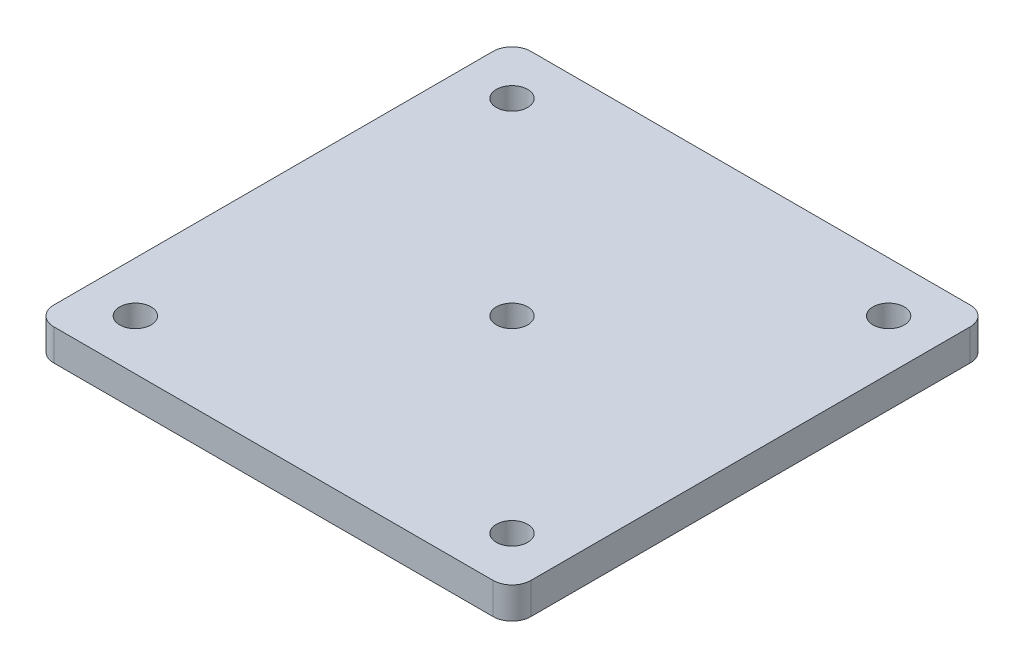
ISO-10303-21;
HEADER;
FILE_DESCRIPTION(('STEP AP214'),'2;1');
FILE_NAME('part.step','',(''),(''),'','','');
FILE_SCHEMA(('AUTOMOTIVE_DESIGN { 1 0 10303 214 1 1 1 1 }'));
ENDSEC;
DATA;
#1=APPLICATION_CONTEXT('core data for automotive mechanical design processes');
#2=APPLICATION_PROTOCOL_DEFINITION('international standard','automotive_design',2000,#1);
#3=PRODUCT_CONTEXT('',#1,'mechanical');
#4=PRODUCT('Part','Part','',(#3));
#5=PRODUCT_RELATED_PRODUCT_CATEGORY('part','',(#4));
#6=PRODUCT_DEFINITION_FORMATION('','',#4);
#7=PRODUCT_DEFINITION_CONTEXT('part definition',#1,'design');
#8=PRODUCT_DEFINITION('design','',#6,#7);
#9=PRODUCT_DEFINITION_SHAPE('','',#8);
#10=(LENGTH_UNIT() NAMED_UNIT(*) SI_UNIT(.MILLI.,.METRE.));
#11=(NAMED_UNIT(*) PLANE_ANGLE_UNIT() SI_UNIT($,.RADIAN.));
#12=(NAMED_UNIT(*) SI_UNIT($,.STERADIAN.) SOLID_ANGLE_UNIT());
#13=UNCERTAINTY_MEASURE_WITH_UNIT(LENGTH_MEASURE(1.E-05),#10,'distance_accuracy_value','');
#14=(GEOMETRIC_REPRESENTATION_CONTEXT(3) GLOBAL_UNCERTAINTY_ASSIGNED_CONTEXT((#13)) GLOBAL_UNIT_ASSIGNED_CONTEXT((#10,
#11,#12)) REPRESENTATION_CONTEXT('',''));
#15=CARTESIAN_POINT('',(0.,0.,0.));
#16=DIRECTION('',(0.,0.,1.));
#17=DIRECTION('',(1.,0.,0.));
#18=AXIS2_PLACEMENT_3D('',#15,#16,#17);
#19=CARTESIAN_POINT('',(35.,5.,-35.));
#20=DIRECTION('',(0.,-1.,0.));
#21=DIRECTION('',(0.,0.,-1.));
#22=AXIS2_PLACEMENT_3D('',#19,#20,#21);
#23=PLANE('',#22);
#24=CARTESIAN_POINT('',(35.,5.,-35.));
#25=DIRECTION('',(0.,1.,0.));
#26=DIRECTION('',(0.,0.,-1.));
#27=AXIS2_PLACEMENT_3D('',#24,#25,#26);
#28=CIRCLE('',#27,3.);
#29=CARTESIAN_POINT('',(38.,5.,-35.));
#30=VERTEX_POINT('',#29);
#31=CARTESIAN_POINT('',(35.,5.,-38.));
#32=VERTEX_POINT('',#31);
#33=EDGE_CURVE('E151',#30,#32,#28,.T.);
#34=ORIENTED_EDGE('',*,*,#33,.T.);
#35=DIRECTION('',(-1.,0.,0.));
#36=VECTOR('',#35,1.);
#37=CARTESIAN_POINT('',(-35.,5.,-38.));
#38=LINE('',#37,#36);
#39=CARTESIAN_POINT('',(-35.,5.,-38.));
#40=VERTEX_POINT('',#39);
#41=EDGE_CURVE('E99',#32,#40,#38,.T.);
#42=ORIENTED_EDGE('',*,*,#41,.T.);
#43=CARTESIAN_POINT('',(-35.,5.,-35.));
#44=DIRECTION('',(0.,1.,0.));
#45=DIRECTION('',(0.,0.,-1.));
#46=AXIS2_PLACEMENT_3D('',#43,#44,#45);
#47=CIRCLE('',#46,3.);
#48=CARTESIAN_POINT('',(-38.,5.,-35.));
#49=VERTEX_POINT('',#48);
#50=EDGE_CURVE('E166',#40,#49,#47,.T.);
#51=ORIENTED_EDGE('',*,*,#50,.T.);
#52=DIRECTION('',(0.,0.,1.));
#53=VECTOR('',#52,1.);
#54=CARTESIAN_POINT('',(-38.,5.,35.));
#55=LINE('',#54,#53);
#56=CARTESIAN_POINT('',(-38.,5.,35.));
#57=VERTEX_POINT('',#56);
#58=EDGE_CURVE('E179',#49,#57,#55,.T.);
#59=ORIENTED_EDGE('',*,*,#58,.T.);
#60=CARTESIAN_POINT('',(-35.,5.,35.));
#61=DIRECTION('',(0.,1.,0.));
#62=DIRECTION('',(0.,0.,-1.));
#63=AXIS2_PLACEMENT_3D('',#60,#61,#62);
#64=CIRCLE('',#63,3.);
#65=CARTESIAN_POINT('',(-35.,5.,38.));
#66=VERTEX_POINT('',#65);
#67=EDGE_CURVE('E118',#57,#66,#64,.T.);
#68=ORIENTED_EDGE('',*,*,#67,.T.);
#69=DIRECTION('',(1.,0.,0.));
#70=VECTOR('',#69,1.);
#71=CARTESIAN_POINT('',(-35.,5.,38.));
#72=LINE('',#71,#70);
#73=CARTESIAN_POINT('',(35.,5.,38.));
#74=VERTEX_POINT('',#73);
#75=EDGE_CURVE('E112',#66,#74,#72,.T.);
#76=ORIENTED_EDGE('',*,*,#75,.T.);
#77=CARTESIAN_POINT('',(35.,5.,35.));
#78=DIRECTION('',(0.,1.,0.));
#79=DIRECTION('',(0.,0.,-1.));
#80=AXIS2_PLACEMENT_3D('',#77,#78,#79);
#81=CIRCLE('',#80,3.);
#82=CARTESIAN_POINT('',(38.,5.,35.));
#83=VERTEX_POINT('',#82);
#84=EDGE_CURVE('E116',#74,#83,#81,.T.);
#85=ORIENTED_EDGE('',*,*,#84,.T.);
#86=DIRECTION('',(0.,0.,-1.));
#87=VECTOR('',#86,1.);
#88=CARTESIAN_POINT('',(38.,5.,35.));
#89=LINE('',#88,#87);
#90=EDGE_CURVE('E56',#83,#30,#89,.T.);
#91=ORIENTED_EDGE('',*,*,#90,.T.);
#92=EDGE_LOOP('',(#34,#42,#51,#59,#68,#76,#85,#91));
#93=FACE_BOUND('',#92,.T.);
#94=CARTESIAN_POINT('',(0.,5.,0.));
#95=DIRECTION('',(0.,1.,0.));
#96=DIRECTION('',(0.,0.,1.));
#97=AXIS2_PLACEMENT_3D('',#94,#95,#96);
#98=CIRCLE('',#97,2.5);
#99=CARTESIAN_POINT('',(0.,5.,2.49999999999999));
#100=VERTEX_POINT('',#99);
#101=EDGE_CURVE('E140',#100,#100,#98,.T.);
#102=ORIENTED_EDGE('',*,*,#101,.F.);
#103=EDGE_LOOP('',(#102));
#104=FACE_BOUND('',#103,.T.);
#105=CARTESIAN_POINT('',(-30.0000000000001,5.,30.0000000000001));
#106=DIRECTION('',(0.,1.,0.));
#107=DIRECTION('',(0.,0.,1.));
#108=AXIS2_PLACEMENT_3D('',#105,#106,#107);
#109=CIRCLE('',#108,2.5);
#110=CARTESIAN_POINT('',(-30.0000000000001,5.,32.5000000000001));
#111=VERTEX_POINT('',#110);
#112=EDGE_CURVE('E188',#111,#111,#109,.T.);
#113=ORIENTED_EDGE('',*,*,#112,.F.);
#114=EDGE_LOOP('',(#113));
#115=FACE_BOUND('',#114,.T.);
#116=CARTESIAN_POINT('',(-30.0000000000001,5.,-30.));
#117=DIRECTION('',(0.,1.,0.));
#118=DIRECTION('',(0.,0.,1.));
#119=AXIS2_PLACEMENT_3D('',#116,#117,#118);
#120=CIRCLE('',#119,2.5);
#121=CARTESIAN_POINT('',(-30.0000000000001,5.,-27.5));
#122=VERTEX_POINT('',#121);
#123=EDGE_CURVE('E194',#122,#122,#120,.T.);
#124=ORIENTED_EDGE('',*,*,#123,.F.);
#125=EDGE_LOOP('',(#124));
#126=FACE_BOUND('',#125,.T.);
#127=CARTESIAN_POINT('',(30.0000000000001,5.,-30.0000000000001));
#128=DIRECTION('',(0.,1.,0.));
#129=DIRECTION('',(0.,0.,1.));
#130=AXIS2_PLACEMENT_3D('',#127,#128,#129);
#131=CIRCLE('',#130,2.49999999999999);
#132=CARTESIAN_POINT('',(30.0000000000001,5.,-27.5000000000001));
#133=VERTEX_POINT('',#132);
#134=EDGE_CURVE('E200',#133,#133,#131,.T.);
#135=ORIENTED_EDGE('',*,*,#134,.F.);
#136=EDGE_LOOP('',(#135));
#137=FACE_BOUND('',#136,.T.);
#138=CARTESIAN_POINT('',(30.0000000000001,5.,30.0000000000001));
#139=DIRECTION('',(0.,1.,0.));
#140=DIRECTION('',(0.,0.,1.));
#141=AXIS2_PLACEMENT_3D('',#138,#139,#140);
#142=CIRCLE('',#141,2.49999999999999);
#143=CARTESIAN_POINT('',(30.0000000000001,5.,32.5000000000001));
#144=VERTEX_POINT('',#143);
#145=EDGE_CURVE('E206',#144,#144,#142,.T.);
#146=ORIENTED_EDGE('',*,*,#145,.F.);
#147=EDGE_LOOP('',(#146));
#148=FACE_BOUND('',#147,.T.);
#149=ADVANCED_FACE('F39',(#93,#104,#115,#126,#137,#148),#23,.F.);
#150=CARTESIAN_POINT('',(35.,0.,-35.));
#151=DIRECTION('',(0.,-1.,0.));
#152=DIRECTION('',(0.,0.,-1.));
#153=AXIS2_PLACEMENT_3D('',#150,#151,#152);
#154=PLANE('',#153);
#155=CARTESIAN_POINT('',(30.0000000000001,0.,-30.0000000000001));
#156=DIRECTION('',(0.,1.,0.));
#157=DIRECTION('',(0.,0.,1.));
#158=AXIS2_PLACEMENT_3D('',#155,#156,#157);
#159=CIRCLE('',#158,2.49999999999999);
#160=CARTESIAN_POINT('',(30.0000000000001,0.,-27.5000000000001));
#161=VERTEX_POINT('',#160);
#162=EDGE_CURVE('E203',#161,#161,#159,.T.);
#163=ORIENTED_EDGE('',*,*,#162,.T.);
#164=EDGE_LOOP('',(#163));
#165=FACE_BOUND('',#164,.T.);
#166=CARTESIAN_POINT('',(-30.0000000000001,0.,30.0000000000001));
#167=DIRECTION('',(0.,1.,0.));
#168=DIRECTION('',(0.,0.,1.));
#169=AXIS2_PLACEMENT_3D('',#166,#167,#168);
#170=CIRCLE('',#169,2.5);
#171=CARTESIAN_POINT('',(-30.0000000000001,0.,32.5000000000001));
#172=VERTEX_POINT('',#171);
#173=EDGE_CURVE('E191',#172,#172,#170,.T.);
#174=ORIENTED_EDGE('',*,*,#173,.T.);
#175=EDGE_LOOP('',(#174));
#176=FACE_BOUND('',#175,.T.);
#177=CARTESIAN_POINT('',(35.,0.,-35.));
#178=DIRECTION('',(0.,1.,0.));
#179=DIRECTION('',(0.,0.,-1.));
#180=AXIS2_PLACEMENT_3D('',#177,#178,#179);
#181=CIRCLE('',#180,3.);
#182=CARTESIAN_POINT('',(38.,0.,-35.));
#183=VERTEX_POINT('',#182);
#184=CARTESIAN_POINT('',(35.,0.,-38.));
#185=VERTEX_POINT('',#184);
#186=EDGE_CURVE('E136',#183,#185,#181,.T.);
#187=ORIENTED_EDGE('',*,*,#186,.F.);
#188=DIRECTION('',(0.,0.,-1.));
#189=VECTOR('',#188,1.);
#190=CARTESIAN_POINT('',(38.,0.,35.));
#191=LINE('',#190,#189);
#192=CARTESIAN_POINT('',(38.,0.,35.));
#193=VERTEX_POINT('',#192);
#194=EDGE_CURVE('E91',#193,#183,#191,.T.);
#195=ORIENTED_EDGE('',*,*,#194,.F.);
#196=CARTESIAN_POINT('',(35.,0.,35.));
#197=DIRECTION('',(0.,1.,0.));
#198=DIRECTION('',(0.,0.,-1.));
#199=AXIS2_PLACEMENT_3D('',#196,#197,#198);
#200=CIRCLE('',#199,3.);
#201=CARTESIAN_POINT('',(35.,0.,38.));
#202=VERTEX_POINT('',#201);
#203=EDGE_CURVE('E85',#202,#193,#200,.T.);
#204=ORIENTED_EDGE('',*,*,#203,.F.);
#205=DIRECTION('',(1.,0.,0.));
#206=VECTOR('',#205,1.);
#207=CARTESIAN_POINT('',(-35.,0.,38.));
#208=LINE('',#207,#206);
#209=CARTESIAN_POINT('',(-35.,0.,38.));
#210=VERTEX_POINT('',#209);
#211=EDGE_CURVE('E126',#210,#202,#208,.T.);
#212=ORIENTED_EDGE('',*,*,#211,.F.);
#213=CARTESIAN_POINT('',(-35.,0.,35.));
#214=DIRECTION('',(0.,1.,0.));
#215=DIRECTION('',(0.,0.,-1.));
#216=AXIS2_PLACEMENT_3D('',#213,#214,#215);
#217=CIRCLE('',#216,3.);
#218=CARTESIAN_POINT('',(-38.,0.,35.));
#219=VERTEX_POINT('',#218);
#220=EDGE_CURVE('E146',#219,#210,#217,.T.);
#221=ORIENTED_EDGE('',*,*,#220,.F.);
#222=DIRECTION('',(0.,0.,1.));
#223=VECTOR('',#222,1.);
#224=CARTESIAN_POINT('',(-38.,0.,35.));
#225=LINE('',#224,#223);
#226=CARTESIAN_POINT('',(-38.,0.,-35.));
#227=VERTEX_POINT('',#226);
#228=EDGE_CURVE('E144',#227,#219,#225,.T.);
#229=ORIENTED_EDGE('',*,*,#228,.F.);
#230=CARTESIAN_POINT('',(-35.,0.,-35.));
#231=DIRECTION('',(0.,1.,0.));
#232=DIRECTION('',(0.,0.,-1.));
#233=AXIS2_PLACEMENT_3D('',#230,#231,#232);
#234=CIRCLE('',#233,3.);
#235=CARTESIAN_POINT('',(-35.,0.,-38.));
#236=VERTEX_POINT('',#235);
#237=EDGE_CURVE('E142',#236,#227,#234,.T.);
#238=ORIENTED_EDGE('',*,*,#237,.F.);
#239=DIRECTION('',(-1.,0.,0.));
#240=VECTOR('',#239,1.);
#241=CARTESIAN_POINT('',(-35.,0.,-38.));
#242=LINE('',#241,#240);
#243=EDGE_CURVE('E139',#185,#236,#242,.T.);
#244=ORIENTED_EDGE('',*,*,#243,.F.);
#245=EDGE_LOOP('',(#187,#195,#204,#212,#221,#229,#238,#244));
#246=FACE_BOUND('',#245,.T.);
#247=CARTESIAN_POINT('',(0.,0.,0.));
#248=DIRECTION('',(0.,1.,0.));
#249=DIRECTION('',(0.,0.,1.));
#250=AXIS2_PLACEMENT_3D('',#247,#248,#249);
#251=CIRCLE('',#250,2.5);
#252=CARTESIAN_POINT('',(0.,0.,2.49999999999999));
#253=VERTEX_POINT('',#252);
#254=EDGE_CURVE('E185',#253,#253,#251,.T.);
#255=ORIENTED_EDGE('',*,*,#254,.T.);
#256=EDGE_LOOP('',(#255));
#257=FACE_BOUND('',#256,.T.);
#258=CARTESIAN_POINT('',(-30.0000000000001,0.,-30.));
#259=DIRECTION('',(0.,1.,0.));
#260=DIRECTION('',(0.,0.,1.));
#261=AXIS2_PLACEMENT_3D('',#258,#259,#260);
#262=CIRCLE('',#261,2.5);
#263=CARTESIAN_POINT('',(-30.0000000000001,0.,-27.5));
#264=VERTEX_POINT('',#263);
#265=EDGE_CURVE('E197',#264,#264,#262,.T.);
#266=ORIENTED_EDGE('',*,*,#265,.T.);
#267=EDGE_LOOP('',(#266));
#268=FACE_BOUND('',#267,.T.);
#269=CARTESIAN_POINT('',(30.0000000000001,0.,30.0000000000001));
#270=DIRECTION('',(0.,1.,0.));
#271=DIRECTION('',(0.,0.,1.));
#272=AXIS2_PLACEMENT_3D('',#269,#270,#271);
#273=CIRCLE('',#272,2.49999999999999);
#274=CARTESIAN_POINT('',(30.0000000000001,0.,32.5000000000001));
#275=VERTEX_POINT('',#274);
#276=EDGE_CURVE('E209',#275,#275,#273,.T.);
#277=ORIENTED_EDGE('',*,*,#276,.T.);
#278=EDGE_LOOP('',(#277));
#279=FACE_BOUND('',#278,.T.);
#280=ADVANCED_FACE('F170',(#165,#176,#246,#257,#268,#279),#154,.T.);
#281=CARTESIAN_POINT('',(35.,5.,-35.));
#282=DIRECTION('',(0.,-1.,0.));
#283=DIRECTION('',(0.,0.,-1.));
#284=AXIS2_PLACEMENT_3D('',#281,#282,#283);
#285=CYLINDRICAL_SURFACE('',#284,3.);
#286=ORIENTED_EDGE('',*,*,#186,.T.);
#287=DIRECTION('',(0.,-1.,0.));
#288=VECTOR('',#287,1.);
#289=CARTESIAN_POINT('',(35.,5.,-38.));
#290=LINE('',#289,#288);
#291=EDGE_CURVE('E11',#32,#185,#290,.T.);
#292=ORIENTED_EDGE('',*,*,#291,.F.);
#293=ORIENTED_EDGE('',*,*,#33,.F.);
#294=DIRECTION('',(0.,-1.,0.));
#295=VECTOR('',#294,1.);
#296=CARTESIAN_POINT('',(38.,5.,-35.));
#297=LINE('',#296,#295);
#298=EDGE_CURVE('E132',#30,#183,#297,.T.);
#299=ORIENTED_EDGE('',*,*,#298,.T.);
#300=EDGE_LOOP('',(#286,#292,#293,#299));
#301=FACE_BOUND('',#300,.T.);
#302=ADVANCED_FACE('F41',(#301),#285,.T.);
#303=CARTESIAN_POINT('',(-35.,5.,-38.));
#304=DIRECTION('',(0.,0.,1.));
#305=DIRECTION('',(1.,0.,0.));
#306=AXIS2_PLACEMENT_3D('',#303,#304,#305);
#307=PLANE('',#306);
#308=ORIENTED_EDGE('',*,*,#243,.T.);
#309=DIRECTION('',(0.,-1.,0.));
#310=VECTOR('',#309,1.);
#311=CARTESIAN_POINT('',(-35.,5.,-38.));
#312=LINE('',#311,#310);
#313=EDGE_CURVE('E48',#40,#236,#312,.T.);
#314=ORIENTED_EDGE('',*,*,#313,.F.);
#315=ORIENTED_EDGE('',*,*,#41,.F.);
#316=ORIENTED_EDGE('',*,*,#291,.T.);
#317=EDGE_LOOP('',(#308,#314,#315,#316));
#318=FACE_BOUND('',#317,.T.);
#319=ADVANCED_FACE('F241',(#318),#307,.F.);
#320=CARTESIAN_POINT('',(-35.,5.,-35.));
#321=DIRECTION('',(0.,-1.,0.));
#322=DIRECTION('',(0.,0.,-1.));
#323=AXIS2_PLACEMENT_3D('',#320,#321,#322);
#324=CYLINDRICAL_SURFACE('',#323,3.);
#325=ORIENTED_EDGE('',*,*,#237,.T.);
#326=DIRECTION('',(0.,-1.,0.));
#327=VECTOR('',#326,1.);
#328=CARTESIAN_POINT('',(-38.,5.,-35.));
#329=LINE('',#328,#327);
#330=EDGE_CURVE('E158',#49,#227,#329,.T.);
#331=ORIENTED_EDGE('',*,*,#330,.F.);
#332=ORIENTED_EDGE('',*,*,#50,.F.);
#333=ORIENTED_EDGE('',*,*,#313,.T.);
#334=EDGE_LOOP('',(#325,#331,#332,#333));
#335=FACE_BOUND('',#334,.T.);
#336=ADVANCED_FACE('F164',(#335),#324,.T.);
#337=CARTESIAN_POINT('',(-38.,5.,35.));
#338=DIRECTION('',(1.,0.,0.));
#339=DIRECTION('',(0.,0.,-1.));
#340=AXIS2_PLACEMENT_3D('',#337,#338,#339);
#341=PLANE('',#340);
#342=ORIENTED_EDGE('',*,*,#228,.T.);
#343=DIRECTION('',(0.,-1.,0.));
#344=VECTOR('',#343,1.);
#345=CARTESIAN_POINT('',(-38.,5.,35.));
#346=LINE('',#345,#344);
#347=EDGE_CURVE('E155',#57,#219,#346,.T.);
#348=ORIENTED_EDGE('',*,*,#347,.F.);
#349=ORIENTED_EDGE('',*,*,#58,.F.);
#350=ORIENTED_EDGE('',*,*,#330,.T.);
#351=EDGE_LOOP('',(#342,#348,#349,#350));
#352=FACE_BOUND('',#351,.T.);
#353=ADVANCED_FACE('F175',(#352),#341,.F.);
#354=CARTESIAN_POINT('',(-35.,5.,35.));
#355=DIRECTION('',(0.,-1.,0.));
#356=DIRECTION('',(0.,0.,-1.));
#357=AXIS2_PLACEMENT_3D('',#354,#355,#356);
#358=CYLINDRICAL_SURFACE('',#357,3.);
#359=ORIENTED_EDGE('',*,*,#220,.T.);
#360=DIRECTION('',(0.,-1.,0.));
#361=VECTOR('',#360,1.);
#362=CARTESIAN_POINT('',(-35.,5.,38.));
#363=LINE('',#362,#361);
#364=EDGE_CURVE('E127',#66,#210,#363,.T.);
#365=ORIENTED_EDGE('',*,*,#364,.F.);
#366=ORIENTED_EDGE('',*,*,#67,.F.);
#367=ORIENTED_EDGE('',*,*,#347,.T.);
#368=EDGE_LOOP('',(#359,#365,#366,#367));
#369=FACE_BOUND('',#368,.T.);
#370=ADVANCED_FACE('F178',(#369),#358,.T.);
#371=CARTESIAN_POINT('',(-35.,5.,38.));
#372=DIRECTION('',(0.,0.,-1.));
#373=DIRECTION('',(-1.,0.,0.));
#374=AXIS2_PLACEMENT_3D('',#371,#372,#373);
#375=PLANE('',#374);
#376=ORIENTED_EDGE('',*,*,#211,.T.);
#377=DIRECTION('',(0.,-1.,0.));
#378=VECTOR('',#377,1.);
#379=CARTESIAN_POINT('',(35.,5.,38.));
#380=LINE('',#379,#378);
#381=EDGE_CURVE('E123',#74,#202,#380,.T.);
#382=ORIENTED_EDGE('',*,*,#381,.F.);
#383=ORIENTED_EDGE('',*,*,#75,.F.);
#384=ORIENTED_EDGE('',*,*,#364,.T.);
#385=EDGE_LOOP('',(#376,#382,#383,#384));
#386=FACE_BOUND('',#385,.T.);
#387=ADVANCED_FACE('F124',(#386),#375,.F.);
#388=CARTESIAN_POINT('',(35.,5.,35.));
#389=DIRECTION('',(0.,-1.,0.));
#390=DIRECTION('',(0.,0.,-1.));
#391=AXIS2_PLACEMENT_3D('',#388,#389,#390);
#392=CYLINDRICAL_SURFACE('',#391,3.);
#393=ORIENTED_EDGE('',*,*,#203,.T.);
#394=DIRECTION('',(0.,-1.,0.));
#395=VECTOR('',#394,1.);
#396=CARTESIAN_POINT('',(38.,5.,35.));
#397=LINE('',#396,#395);
#398=EDGE_CURVE('E128',#83,#193,#397,.T.);
#399=ORIENTED_EDGE('',*,*,#398,.F.);
#400=ORIENTED_EDGE('',*,*,#84,.F.);
#401=ORIENTED_EDGE('',*,*,#381,.T.);
#402=EDGE_LOOP('',(#393,#399,#400,#401));
#403=FACE_BOUND('',#402,.T.);
#404=ADVANCED_FACE('F130',(#403),#392,.T.);
#405=CARTESIAN_POINT('',(38.,5.,35.));
#406=DIRECTION('',(-1.,0.,0.));
#407=DIRECTION('',(0.,0.,1.));
#408=AXIS2_PLACEMENT_3D('',#405,#406,#407);
#409=PLANE('',#408);
#410=ORIENTED_EDGE('',*,*,#194,.T.);
#411=ORIENTED_EDGE('',*,*,#298,.F.);
#412=ORIENTED_EDGE('',*,*,#90,.F.);
#413=ORIENTED_EDGE('',*,*,#398,.T.);
#414=EDGE_LOOP('',(#410,#411,#412,#413));
#415=FACE_BOUND('',#414,.T.);
#416=ADVANCED_FACE('F229',(#415),#409,.F.);
#417=CARTESIAN_POINT('',(0.,5.,0.));
#418=DIRECTION('',(0.,-1.,0.));
#419=DIRECTION('',(0.,0.,-1.));
#420=AXIS2_PLACEMENT_3D('',#417,#418,#419);
#421=CYLINDRICAL_SURFACE('',#420,2.5);
#422=ORIENTED_EDGE('',*,*,#101,.T.);
#423=EDGE_LOOP('',(#422));
#424=FACE_BOUND('',#423,.T.);
#425=ORIENTED_EDGE('',*,*,#254,.F.);
#426=EDGE_LOOP('',(#425));
#427=FACE_BOUND('',#426,.T.);
#428=ADVANCED_FACE('F226',(#424,#427),#421,.F.);
#429=CARTESIAN_POINT('',(-30.0000000000001,5.,30.0000000000001));
#430=DIRECTION('',(0.,-1.,0.));
#431=DIRECTION('',(0.,0.,-1.));
#432=AXIS2_PLACEMENT_3D('',#429,#430,#431);
#433=CYLINDRICAL_SURFACE('',#432,2.5);
#434=ORIENTED_EDGE('',*,*,#112,.T.);
#435=EDGE_LOOP('',(#434));
#436=FACE_BOUND('',#435,.T.);
#437=ORIENTED_EDGE('',*,*,#173,.F.);
#438=EDGE_LOOP('',(#437));
#439=FACE_BOUND('',#438,.T.);
#440=ADVANCED_FACE('F304',(#436,#439),#433,.F.);
#441=CARTESIAN_POINT('',(-30.0000000000001,5.,-30.));
#442=DIRECTION('',(0.,-1.,0.));
#443=DIRECTION('',(0.,0.,-1.));
#444=AXIS2_PLACEMENT_3D('',#441,#442,#443);
#445=CYLINDRICAL_SURFACE('',#444,2.5);
#446=ORIENTED_EDGE('',*,*,#123,.T.);
#447=EDGE_LOOP('',(#446));
#448=FACE_BOUND('',#447,.T.);
#449=ORIENTED_EDGE('',*,*,#265,.F.);
#450=EDGE_LOOP('',(#449));
#451=FACE_BOUND('',#450,.T.);
#452=ADVANCED_FACE('F312',(#448,#451),#445,.F.);
#453=CARTESIAN_POINT('',(30.0000000000001,5.,-30.0000000000001));
#454=DIRECTION('',(0.,-1.,0.));
#455=DIRECTION('',(0.,0.,-1.));
#456=AXIS2_PLACEMENT_3D('',#453,#454,#455);
#457=CYLINDRICAL_SURFACE('',#456,2.49999999999999);
#458=ORIENTED_EDGE('',*,*,#134,.T.);
#459=EDGE_LOOP('',(#458));
#460=FACE_BOUND('',#459,.T.);
#461=ORIENTED_EDGE('',*,*,#162,.F.);
#462=EDGE_LOOP('',(#461));
#463=FACE_BOUND('',#462,.T.);
#464=ADVANCED_FACE('F320',(#460,#463),#457,.F.);
#465=CARTESIAN_POINT('',(30.0000000000001,5.,30.0000000000001));
#466=DIRECTION('',(0.,-1.,0.));
#467=DIRECTION('',(0.,0.,-1.));
#468=AXIS2_PLACEMENT_3D('',#465,#466,#467);
#469=CYLINDRICAL_SURFACE('',#468,2.49999999999999);
#470=ORIENTED_EDGE('',*,*,#145,.T.);
#471=EDGE_LOOP('',(#470));
#472=FACE_BOUND('',#471,.T.);
#473=ORIENTED_EDGE('',*,*,#276,.F.);
#474=EDGE_LOOP('',(#473));
#475=FACE_BOUND('',#474,.T.);
#476=ADVANCED_FACE('F215',(#472,#475),#469,.F.);
#477=CLOSED_SHELL('',(#149,#280,#302,#319,#336,#353,#370,#387,#404,#416,#428,#440,#452,#464,#476));
#478=MANIFOLD_SOLID_BREP('B2',#477);
#479=ADVANCED_BREP_SHAPE_REPRESENTATION('',(#18,#478),#14);
#480=SHAPE_DEFINITION_REPRESENTATION(#9,#479);
ENDSEC;
END-ISO-10303-21;
